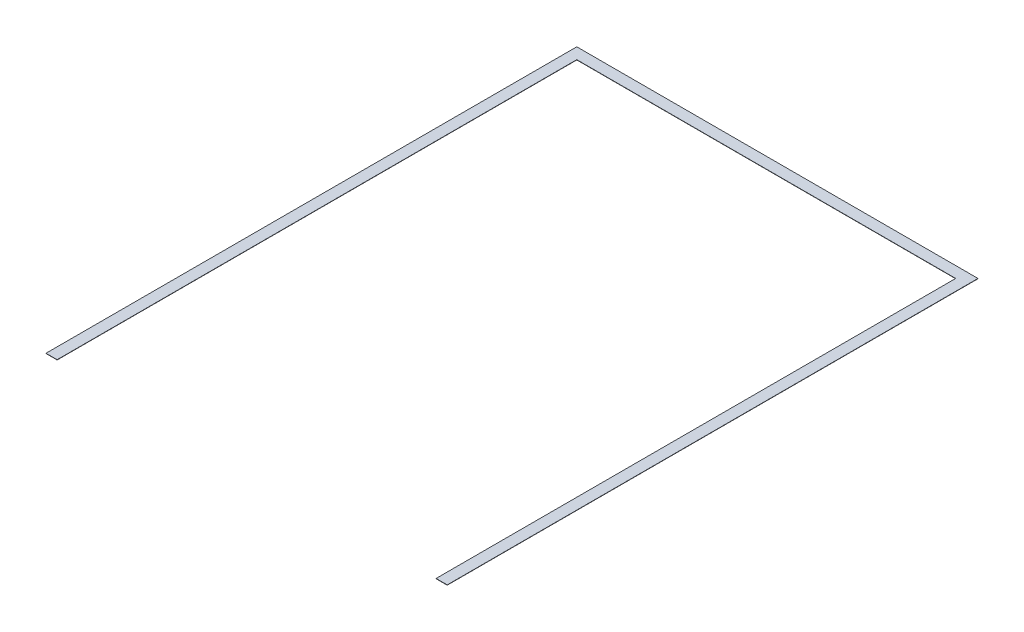
ISO-10303-21;
HEADER;
FILE_DESCRIPTION(('STEP AP214'),'2;1');
FILE_NAME('part.step','',(''),(''),'','','');
FILE_SCHEMA(('AUTOMOTIVE_DESIGN { 1 0 10303 214 1 1 1 1 }'));
ENDSEC;
DATA;
#1=APPLICATION_CONTEXT('core data for automotive mechanical design processes');
#2=APPLICATION_PROTOCOL_DEFINITION('international standard','automotive_design',2000,#1);
#3=PRODUCT_CONTEXT('',#1,'mechanical');
#4=PRODUCT('Part','Part','',(#3));
#5=PRODUCT_RELATED_PRODUCT_CATEGORY('part','',(#4));
#6=PRODUCT_DEFINITION_FORMATION('','',#4);
#7=PRODUCT_DEFINITION_CONTEXT('part definition',#1,'design');
#8=PRODUCT_DEFINITION('design','',#6,#7);
#9=PRODUCT_DEFINITION_SHAPE('','',#8);
#10=(LENGTH_UNIT() NAMED_UNIT(*) SI_UNIT(.MILLI.,.METRE.));
#11=(NAMED_UNIT(*) PLANE_ANGLE_UNIT() SI_UNIT($,.RADIAN.));
#12=(NAMED_UNIT(*) SI_UNIT($,.STERADIAN.) SOLID_ANGLE_UNIT());
#13=UNCERTAINTY_MEASURE_WITH_UNIT(LENGTH_MEASURE(1.E-05),#10,'distance_accuracy_value','');
#14=(GEOMETRIC_REPRESENTATION_CONTEXT(3) GLOBAL_UNCERTAINTY_ASSIGNED_CONTEXT((#13)) GLOBAL_UNIT_ASSIGNED_CONTEXT((#10,
#11,#12)) REPRESENTATION_CONTEXT('',''));
#15=CARTESIAN_POINT('',(0.,0.,0.));
#16=DIRECTION('',(0.,0.,1.));
#17=DIRECTION('',(1.,0.,0.));
#18=AXIS2_PLACEMENT_3D('',#15,#16,#17);
#19=CARTESIAN_POINT('',(0.,0.,0.));
#20=DIRECTION('',(0.,-1.,0.));
#21=DIRECTION('',(0.,0.,-1.));
#22=AXIS2_PLACEMENT_3D('',#19,#20,#21);
#23=PLANE('',#22);
#24=DIRECTION('',(-1.,0.,0.));
#25=VECTOR('',#24,1.);
#26=CARTESIAN_POINT('',(863.6,0.,50.8));
#27=LINE('',#26,#25);
#28=CARTESIAN_POINT('',(863.6,0.,50.8000000000001));
#29=VERTEX_POINT('',#28);
#30=CARTESIAN_POINT('',(-863.6,0.,50.8000000000001));
#31=VERTEX_POINT('',#30);
#32=EDGE_CURVE('E115',#29,#31,#27,.T.);
#33=ORIENTED_EDGE('',*,*,#32,.T.);
#34=DIRECTION('',(0.,0.,1.));
#35=VECTOR('',#34,1.);
#36=CARTESIAN_POINT('',(-863.6,0.,50.8));
#37=LINE('',#36,#35);
#38=CARTESIAN_POINT('',(-863.6,0.,2419.35));
#39=VERTEX_POINT('',#38);
#40=EDGE_CURVE('E120',#31,#39,#37,.T.);
#41=ORIENTED_EDGE('',*,*,#40,.T.);
#42=DIRECTION('',(-1.,0.,0.));
#43=VECTOR('',#42,1.);
#44=CARTESIAN_POINT('',(-863.6,0.,2419.35));
#45=LINE('',#44,#43);
#46=CARTESIAN_POINT('',(-914.4,0.,2419.35));
#47=VERTEX_POINT('',#46);
#48=EDGE_CURVE('E82',#39,#47,#45,.T.);
#49=ORIENTED_EDGE('',*,*,#48,.T.);
#50=DIRECTION('',(0.,0.,-1.));
#51=VECTOR('',#50,1.);
#52=CARTESIAN_POINT('',(-914.4,0.,2419.35));
#53=LINE('',#52,#51);
#54=CARTESIAN_POINT('',(-914.4,0.,0.));
#55=VERTEX_POINT('',#54);
#56=EDGE_CURVE('E20',#47,#55,#53,.T.);
#57=ORIENTED_EDGE('',*,*,#56,.T.);
#58=DIRECTION('',(1.,0.,0.));
#59=VECTOR('',#58,1.);
#60=CARTESIAN_POINT('',(-914.4,0.,0.));
#61=LINE('',#60,#59);
#62=CARTESIAN_POINT('',(914.4,0.,0.));
#63=VERTEX_POINT('',#62);
#64=EDGE_CURVE('E79',#55,#63,#61,.T.);
#65=ORIENTED_EDGE('',*,*,#64,.T.);
#66=DIRECTION('',(0.,0.,1.));
#67=VECTOR('',#66,1.);
#68=CARTESIAN_POINT('',(914.4,0.,0.));
#69=LINE('',#68,#67);
#70=CARTESIAN_POINT('',(914.4,0.,2419.35));
#71=VERTEX_POINT('',#70);
#72=EDGE_CURVE('E100',#63,#71,#69,.T.);
#73=ORIENTED_EDGE('',*,*,#72,.T.);
#74=DIRECTION('',(-1.,0.,0.));
#75=VECTOR('',#74,1.);
#76=CARTESIAN_POINT('',(914.4,0.,2419.35));
#77=LINE('',#76,#75);
#78=CARTESIAN_POINT('',(863.6,0.,2419.35));
#79=VERTEX_POINT('',#78);
#80=EDGE_CURVE('E105',#71,#79,#77,.T.);
#81=ORIENTED_EDGE('',*,*,#80,.T.);
#82=DIRECTION('',(0.,0.,-1.));
#83=VECTOR('',#82,1.);
#84=CARTESIAN_POINT('',(863.6,0.,2419.35));
#85=LINE('',#84,#83);
#86=EDGE_CURVE('E110',#79,#29,#85,.T.);
#87=ORIENTED_EDGE('',*,*,#86,.T.);
#88=EDGE_LOOP('',(#33,#41,#49,#57,#65,#73,#81,#87));
#89=FACE_BOUND('',#88,.T.);
#90=ADVANCED_FACE('F17',(#89),#23,.T.);
#91=CARTESIAN_POINT('',(-914.4,3.175,2419.35));
#92=DIRECTION('',(1.,0.,0.));
#93=DIRECTION('',(0.,0.,-1.));
#94=AXIS2_PLACEMENT_3D('',#91,#92,#93);
#95=PLANE('',#94);
#96=DIRECTION('',(0.,1.,0.));
#97=VECTOR('',#96,1.);
#98=CARTESIAN_POINT('',(-914.4,3.175,2419.35));
#99=LINE('',#98,#97);
#100=CARTESIAN_POINT('',(-914.4,1.27,2419.35));
#101=VERTEX_POINT('',#100);
#102=EDGE_CURVE('E122',#47,#101,#99,.T.);
#103=ORIENTED_EDGE('',*,*,#102,.T.);
#104=DIRECTION('',(0.,0.,-1.));
#105=VECTOR('',#104,1.);
#106=CARTESIAN_POINT('',(-914.4,1.27,0.));
#107=LINE('',#106,#105);
#108=CARTESIAN_POINT('',(-914.4,1.27,0.));
#109=VERTEX_POINT('',#108);
#110=EDGE_CURVE('E97',#101,#109,#107,.T.);
#111=ORIENTED_EDGE('',*,*,#110,.T.);
#112=DIRECTION('',(0.,1.,0.));
#113=VECTOR('',#112,1.);
#114=CARTESIAN_POINT('',(-914.4,3.175,0.));
#115=LINE('',#114,#113);
#116=EDGE_CURVE('E87',#109,#55,#115,.F.);
#117=ORIENTED_EDGE('',*,*,#116,.T.);
#118=ORIENTED_EDGE('',*,*,#56,.F.);
#119=EDGE_LOOP('',(#103,#111,#117,#118));
#120=FACE_BOUND('',#119,.T.);
#121=ADVANCED_FACE('F96',(#120),#95,.F.);
#122=CARTESIAN_POINT('',(-914.4,3.175,0.));
#123=DIRECTION('',(0.,0.,1.));
#124=DIRECTION('',(1.,0.,0.));
#125=AXIS2_PLACEMENT_3D('',#122,#123,#124);
#126=PLANE('',#125);
#127=ORIENTED_EDGE('',*,*,#116,.F.);
#128=DIRECTION('',(1.,0.,0.));
#129=VECTOR('',#128,1.);
#130=CARTESIAN_POINT('',(0.,1.27,0.));
#131=LINE('',#130,#129);
#132=CARTESIAN_POINT('',(914.4,1.27,0.));
#133=VERTEX_POINT('',#132);
#134=EDGE_CURVE('E127',#109,#133,#131,.T.);
#135=ORIENTED_EDGE('',*,*,#134,.T.);
#136=DIRECTION('',(0.,1.,0.));
#137=VECTOR('',#136,1.);
#138=CARTESIAN_POINT('',(914.4,3.175,0.));
#139=LINE('',#138,#137);
#140=EDGE_CURVE('E93',#133,#63,#139,.F.);
#141=ORIENTED_EDGE('',*,*,#140,.T.);
#142=ORIENTED_EDGE('',*,*,#64,.F.);
#143=EDGE_LOOP('',(#127,#135,#141,#142));
#144=FACE_BOUND('',#143,.T.);
#145=ADVANCED_FACE('F90',(#144),#126,.F.);
#146=CARTESIAN_POINT('',(914.4,3.175,0.));
#147=DIRECTION('',(-1.,0.,0.));
#148=DIRECTION('',(0.,0.,1.));
#149=AXIS2_PLACEMENT_3D('',#146,#147,#148);
#150=PLANE('',#149);
#151=ORIENTED_EDGE('',*,*,#140,.F.);
#152=DIRECTION('',(0.,0.,-1.));
#153=VECTOR('',#152,1.);
#154=CARTESIAN_POINT('',(914.4,1.27,0.));
#155=LINE('',#154,#153);
#156=CARTESIAN_POINT('',(914.4,1.27,2419.35));
#157=VERTEX_POINT('',#156);
#158=EDGE_CURVE('E129',#133,#157,#155,.F.);
#159=ORIENTED_EDGE('',*,*,#158,.T.);
#160=DIRECTION('',(0.,1.,0.));
#161=VECTOR('',#160,1.);
#162=CARTESIAN_POINT('',(914.4,3.175,2419.35));
#163=LINE('',#162,#161);
#164=EDGE_CURVE('E102',#157,#71,#163,.F.);
#165=ORIENTED_EDGE('',*,*,#164,.T.);
#166=ORIENTED_EDGE('',*,*,#72,.F.);
#167=EDGE_LOOP('',(#151,#159,#165,#166));
#168=FACE_BOUND('',#167,.T.);
#169=ADVANCED_FACE('F162',(#168),#150,.F.);
#170=CARTESIAN_POINT('',(914.4,3.175,2419.35));
#171=DIRECTION('',(0.,0.,-1.));
#172=DIRECTION('',(-1.,0.,0.));
#173=AXIS2_PLACEMENT_3D('',#170,#171,#172);
#174=PLANE('',#173);
#175=ORIENTED_EDGE('',*,*,#164,.F.);
#176=DIRECTION('',(1.,0.,0.));
#177=VECTOR('',#176,1.);
#178=CARTESIAN_POINT('',(0.,1.27,2419.35));
#179=LINE('',#178,#177);
#180=CARTESIAN_POINT('',(863.6,1.27,2419.35));
#181=VERTEX_POINT('',#180);
#182=EDGE_CURVE('E132',#157,#181,#179,.F.);
#183=ORIENTED_EDGE('',*,*,#182,.T.);
#184=DIRECTION('',(0.,1.,0.));
#185=VECTOR('',#184,1.);
#186=CARTESIAN_POINT('',(863.6,3.175,2419.35));
#187=LINE('',#186,#185);
#188=EDGE_CURVE('E107',#181,#79,#187,.F.);
#189=ORIENTED_EDGE('',*,*,#188,.T.);
#190=ORIENTED_EDGE('',*,*,#80,.F.);
#191=EDGE_LOOP('',(#175,#183,#189,#190));
#192=FACE_BOUND('',#191,.T.);
#193=ADVANCED_FACE('F159',(#192),#174,.F.);
#194=CARTESIAN_POINT('',(863.6,3.175,2419.35));
#195=DIRECTION('',(1.,0.,0.));
#196=DIRECTION('',(0.,0.,-1.));
#197=AXIS2_PLACEMENT_3D('',#194,#195,#196);
#198=PLANE('',#197);
#199=ORIENTED_EDGE('',*,*,#188,.F.);
#200=DIRECTION('',(0.,0.,-1.));
#201=VECTOR('',#200,1.);
#202=CARTESIAN_POINT('',(863.6,1.27,0.));
#203=LINE('',#202,#201);
#204=CARTESIAN_POINT('',(863.6,1.27,50.8000000000001));
#205=VERTEX_POINT('',#204);
#206=EDGE_CURVE('E135',#181,#205,#203,.T.);
#207=ORIENTED_EDGE('',*,*,#206,.T.);
#208=DIRECTION('',(0.,1.,0.));
#209=VECTOR('',#208,1.);
#210=CARTESIAN_POINT('',(863.6,3.175,50.8));
#211=LINE('',#210,#209);
#212=EDGE_CURVE('E112',#205,#29,#211,.F.);
#213=ORIENTED_EDGE('',*,*,#212,.T.);
#214=ORIENTED_EDGE('',*,*,#86,.F.);
#215=EDGE_LOOP('',(#199,#207,#213,#214));
#216=FACE_BOUND('',#215,.T.);
#217=ADVANCED_FACE('F155',(#216),#198,.F.);
#218=CARTESIAN_POINT('',(863.6,3.175,50.8));
#219=DIRECTION('',(0.,0.,-1.));
#220=DIRECTION('',(-1.,0.,0.));
#221=AXIS2_PLACEMENT_3D('',#218,#219,#220);
#222=PLANE('',#221);
#223=ORIENTED_EDGE('',*,*,#212,.F.);
#224=DIRECTION('',(1.,0.,0.));
#225=VECTOR('',#224,1.);
#226=CARTESIAN_POINT('',(0.,1.27,50.8));
#227=LINE('',#226,#225);
#228=CARTESIAN_POINT('',(-863.6,1.27,50.8000000000001));
#229=VERTEX_POINT('',#228);
#230=EDGE_CURVE('E138',#205,#229,#227,.F.);
#231=ORIENTED_EDGE('',*,*,#230,.T.);
#232=DIRECTION('',(0.,1.,0.));
#233=VECTOR('',#232,1.);
#234=CARTESIAN_POINT('',(-863.6,3.175,50.8));
#235=LINE('',#234,#233);
#236=EDGE_CURVE('E117',#229,#31,#235,.F.);
#237=ORIENTED_EDGE('',*,*,#236,.T.);
#238=ORIENTED_EDGE('',*,*,#32,.F.);
#239=EDGE_LOOP('',(#223,#231,#237,#238));
#240=FACE_BOUND('',#239,.T.);
#241=ADVANCED_FACE('F151',(#240),#222,.F.);
#242=CARTESIAN_POINT('',(-863.6,3.175,50.8));
#243=DIRECTION('',(-1.,0.,0.));
#244=DIRECTION('',(0.,0.,1.));
#245=AXIS2_PLACEMENT_3D('',#242,#243,#244);
#246=PLANE('',#245);
#247=ORIENTED_EDGE('',*,*,#236,.F.);
#248=DIRECTION('',(0.,0.,-1.));
#249=VECTOR('',#248,1.);
#250=CARTESIAN_POINT('',(-863.6,1.27,0.));
#251=LINE('',#250,#249);
#252=CARTESIAN_POINT('',(-863.6,1.27,2419.35));
#253=VERTEX_POINT('',#252);
#254=EDGE_CURVE('E26',#229,#253,#251,.F.);
#255=ORIENTED_EDGE('',*,*,#254,.T.);
#256=DIRECTION('',(0.,1.,0.));
#257=VECTOR('',#256,1.);
#258=CARTESIAN_POINT('',(-863.6,3.175,2419.35));
#259=LINE('',#258,#257);
#260=EDGE_CURVE('E34',#253,#39,#259,.F.);
#261=ORIENTED_EDGE('',*,*,#260,.T.);
#262=ORIENTED_EDGE('',*,*,#40,.F.);
#263=EDGE_LOOP('',(#247,#255,#261,#262));
#264=FACE_BOUND('',#263,.T.);
#265=ADVANCED_FACE('F144',(#264),#246,.F.);
#266=CARTESIAN_POINT('',(-863.6,3.175,2419.35));
#267=DIRECTION('',(0.,0.,-1.));
#268=DIRECTION('',(-1.,0.,0.));
#269=AXIS2_PLACEMENT_3D('',#266,#267,#268);
#270=PLANE('',#269);
#271=ORIENTED_EDGE('',*,*,#260,.F.);
#272=DIRECTION('',(1.,0.,0.));
#273=VECTOR('',#272,1.);
#274=CARTESIAN_POINT('',(0.,1.27,2419.35));
#275=LINE('',#274,#273);
#276=EDGE_CURVE('E11',#253,#101,#275,.F.);
#277=ORIENTED_EDGE('',*,*,#276,.T.);
#278=ORIENTED_EDGE('',*,*,#102,.F.);
#279=ORIENTED_EDGE('',*,*,#48,.F.);
#280=EDGE_LOOP('',(#271,#277,#278,#279));
#281=FACE_BOUND('',#280,.T.);
#282=ADVANCED_FACE('F163',(#281),#270,.F.);
#283=CARTESIAN_POINT('',(0.,1.27,0.));
#284=DIRECTION('',(0.,-1.,0.));
#285=DIRECTION('',(0.,0.,-1.));
#286=AXIS2_PLACEMENT_3D('',#283,#284,#285);
#287=PLANE('',#286);
#288=ORIENTED_EDGE('',*,*,#254,.F.);
#289=ORIENTED_EDGE('',*,*,#230,.F.);
#290=ORIENTED_EDGE('',*,*,#206,.F.);
#291=ORIENTED_EDGE('',*,*,#182,.F.);
#292=ORIENTED_EDGE('',*,*,#158,.F.);
#293=ORIENTED_EDGE('',*,*,#134,.F.);
#294=ORIENTED_EDGE('',*,*,#110,.F.);
#295=ORIENTED_EDGE('',*,*,#276,.F.);
#296=EDGE_LOOP('',(#288,#289,#290,#291,#292,#293,#294,#295));
#297=FACE_BOUND('',#296,.T.);
#298=ADVANCED_FACE('F148',(#297),#287,.F.);
#299=CLOSED_SHELL('',(#90,#121,#145,#169,#193,#217,#241,#265,#282,#298));
#300=MANIFOLD_SOLID_BREP('B1',#299);
#301=ADVANCED_BREP_SHAPE_REPRESENTATION('',(#18,#300),#14);
#302=SHAPE_DEFINITION_REPRESENTATION(#9,#301);
ENDSEC;
END-ISO-10303-21;
